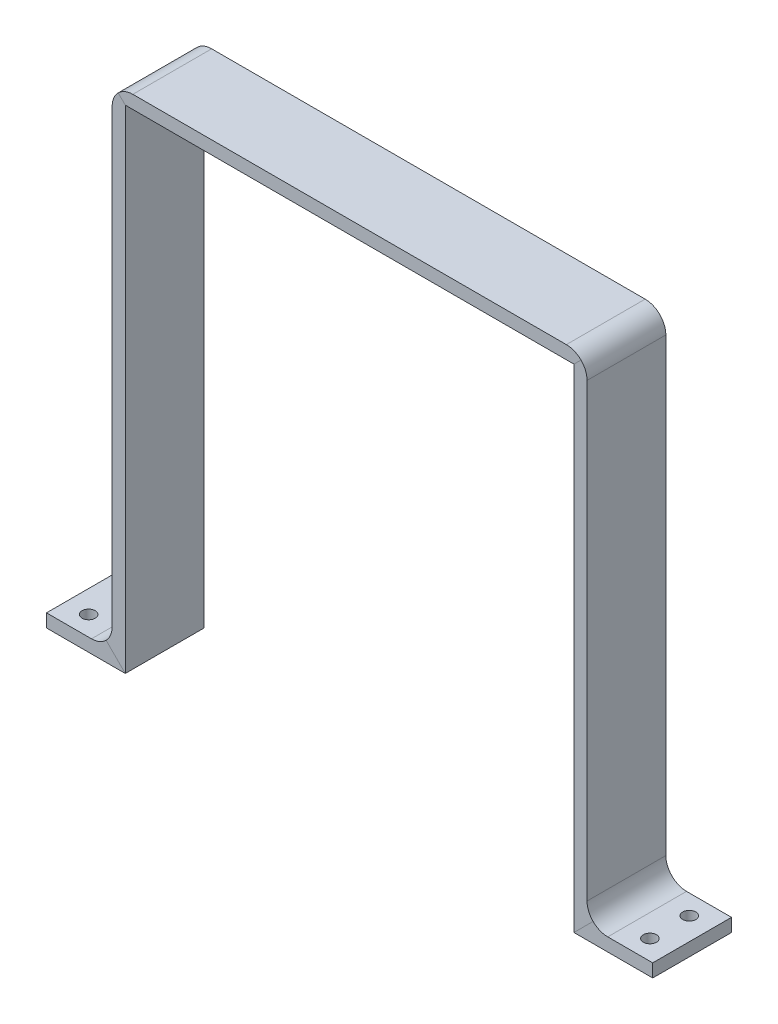
ISO-10303-21;
HEADER;
FILE_DESCRIPTION(('STEP AP214'),'2;1');
FILE_NAME('part.step','',(''),(''),'','','');
FILE_SCHEMA(('AUTOMOTIVE_DESIGN { 1 0 10303 214 1 1 1 1 }'));
ENDSEC;
DATA;
#1=APPLICATION_CONTEXT('core data for automotive mechanical design processes');
#2=APPLICATION_PROTOCOL_DEFINITION('international standard','automotive_design',2000,#1);
#3=PRODUCT_CONTEXT('',#1,'mechanical');
#4=PRODUCT('Part','Part','',(#3));
#5=PRODUCT_RELATED_PRODUCT_CATEGORY('part','',(#4));
#6=PRODUCT_DEFINITION_FORMATION('','',#4);
#7=PRODUCT_DEFINITION_CONTEXT('part definition',#1,'design');
#8=PRODUCT_DEFINITION('design','',#6,#7);
#9=PRODUCT_DEFINITION_SHAPE('','',#8);
#10=(LENGTH_UNIT() NAMED_UNIT(*) SI_UNIT(.MILLI.,.METRE.));
#11=(NAMED_UNIT(*) PLANE_ANGLE_UNIT() SI_UNIT($,.RADIAN.));
#12=(NAMED_UNIT(*) SI_UNIT($,.STERADIAN.) SOLID_ANGLE_UNIT());
#13=UNCERTAINTY_MEASURE_WITH_UNIT(LENGTH_MEASURE(1.E-05),#10,'distance_accuracy_value','');
#14=(GEOMETRIC_REPRESENTATION_CONTEXT(3) GLOBAL_UNCERTAINTY_ASSIGNED_CONTEXT((#13)) GLOBAL_UNIT_ASSIGNED_CONTEXT((#10,
#11,#12)) REPRESENTATION_CONTEXT('',''));
#15=CARTESIAN_POINT('',(0.,0.,0.));
#16=DIRECTION('',(0.,0.,1.));
#17=DIRECTION('',(1.,0.,0.));
#18=AXIS2_PLACEMENT_3D('',#15,#16,#17);
#19=CARTESIAN_POINT('',(0.,0.,0.));
#20=DIRECTION('',(-1.,0.,0.));
#21=DIRECTION('',(0.,0.,1.));
#22=AXIS2_PLACEMENT_3D('',#19,#20,#21);
#23=PLANE('',#22);
#24=DIRECTION('',(0.,-1.,0.));
#25=VECTOR('',#24,1.);
#26=CARTESIAN_POINT('',(0.,0.,0.));
#27=LINE('',#26,#25);
#28=CARTESIAN_POINT('',(0.,6.35,0.));
#29=VERTEX_POINT('',#28);
#30=CARTESIAN_POINT('',(0.,0.,0.));
#31=VERTEX_POINT('',#30);
#32=EDGE_CURVE('E282',#29,#31,#27,.T.);
#33=ORIENTED_EDGE('',*,*,#32,.F.);
#34=DIRECTION('',(0.,0.,1.));
#35=VECTOR('',#34,1.);
#36=CARTESIAN_POINT('',(0.,6.35,0.));
#37=LINE('',#36,#35);
#38=CARTESIAN_POINT('',(0.,6.35,-38.1));
#39=VERTEX_POINT('',#38);
#40=EDGE_CURVE('E291',#39,#29,#37,.T.);
#41=ORIENTED_EDGE('',*,*,#40,.F.);
#42=DIRECTION('',(0.,1.,0.));
#43=VECTOR('',#42,1.);
#44=CARTESIAN_POINT('',(0.,0.,-38.1));
#45=LINE('',#44,#43);
#46=CARTESIAN_POINT('',(0.,0.,-38.1));
#47=VERTEX_POINT('',#46);
#48=EDGE_CURVE('E295',#47,#39,#45,.T.);
#49=ORIENTED_EDGE('',*,*,#48,.F.);
#50=DIRECTION('',(0.,0.,-1.));
#51=VECTOR('',#50,1.);
#52=CARTESIAN_POINT('',(0.,0.,0.));
#53=LINE('',#52,#51);
#54=EDGE_CURVE('E278',#31,#47,#53,.T.);
#55=ORIENTED_EDGE('',*,*,#54,.F.);
#56=EDGE_LOOP('',(#33,#41,#49,#55));
#57=FACE_BOUND('',#56,.T.);
#58=ADVANCED_FACE('F39',(#57),#23,.T.);
#59=CARTESIAN_POINT('',(31.015,237.998,-38.1));
#60=DIRECTION('',(0.,0.,-1.));
#61=DIRECTION('',(-1.,0.,0.));
#62=AXIS2_PLACEMENT_3D('',#59,#60,#61);
#63=PLANE('',#62);
#64=DIRECTION('',(1.,0.,0.));
#65=VECTOR('',#64,1.);
#66=CARTESIAN_POINT('',(31.015,244.348,-38.1));
#67=LINE('',#66,#65);
#68=CARTESIAN_POINT('',(41.75,244.348,-38.1));
#69=VERTEX_POINT('',#68);
#70=CARTESIAN_POINT('',(251.366,244.348,-38.1));
#71=VERTEX_POINT('',#70);
#72=EDGE_CURVE('E351',#69,#71,#67,.T.);
#73=ORIENTED_EDGE('',*,*,#72,.T.);
#74=CARTESIAN_POINT('',(251.366,234.348,-38.1));
#75=DIRECTION('',(0.,0.,-1.));
#76=DIRECTION('',(-1.,0.,0.));
#77=AXIS2_PLACEMENT_3D('',#74,#75,#76);
#78=CIRCLE('',#77,10.);
#79=CARTESIAN_POINT('',(258.437067811865,241.419067811865,-38.1));
#80=VERTEX_POINT('',#79);
#81=EDGE_CURVE('E416',#71,#80,#78,.T.);
#82=ORIENTED_EDGE('',*,*,#81,.T.);
#83=DIRECTION('',(0.707106781186547,0.707106781186547,0.));
#84=VECTOR('',#83,1.);
#85=CARTESIAN_POINT('',(136.017,118.999,-38.1));
#86=LINE('',#85,#84);
#87=CARTESIAN_POINT('',(255.016,237.998,-38.1));
#88=VERTEX_POINT('',#87);
#89=EDGE_CURVE('E184',#88,#80,#86,.T.);
#90=ORIENTED_EDGE('',*,*,#89,.F.);
#91=DIRECTION('',(1.,0.,0.));
#92=VECTOR('',#91,1.);
#93=CARTESIAN_POINT('',(31.015,237.998,-38.1));
#94=LINE('',#93,#92);
#95=CARTESIAN_POINT('',(38.1,237.998,-38.1));
#96=VERTEX_POINT('',#95);
#97=EDGE_CURVE('E330',#96,#88,#94,.T.);
#98=ORIENTED_EDGE('',*,*,#97,.F.);
#99=DIRECTION('',(0.707106781186548,-0.707106781186548,0.));
#100=VECTOR('',#99,1.);
#101=CARTESIAN_POINT('',(157.099,118.999,-38.1));
#102=LINE('',#101,#100);
#103=CARTESIAN_POINT('',(34.6789321881345,241.419067811865,-38.1));
#104=VERTEX_POINT('',#103);
#105=EDGE_CURVE('E324',#104,#96,#102,.T.);
#106=ORIENTED_EDGE('',*,*,#105,.F.);
#107=CARTESIAN_POINT('',(41.75,234.348,-38.1));
#108=DIRECTION('',(0.,0.,-1.));
#109=DIRECTION('',(-1.,0.,0.));
#110=AXIS2_PLACEMENT_3D('',#107,#108,#109);
#111=CIRCLE('',#110,10.);
#112=EDGE_CURVE('E370',#104,#69,#111,.T.);
#113=ORIENTED_EDGE('',*,*,#112,.T.);
#114=EDGE_LOOP('',(#73,#82,#90,#98,#106,#113));
#115=FACE_BOUND('',#114,.T.);
#116=ADVANCED_FACE('F460',(#115),#63,.T.);
#117=CARTESIAN_POINT('',(31.015,244.348,0.));
#118=DIRECTION('',(0.,1.,0.));
#119=DIRECTION('',(0.,0.,1.));
#120=AXIS2_PLACEMENT_3D('',#117,#118,#119);
#121=PLANE('',#120);
#122=DIRECTION('',(1.,0.,0.));
#123=VECTOR('',#122,1.);
#124=CARTESIAN_POINT('',(31.015,244.348,0.));
#125=LINE('',#124,#123);
#126=CARTESIAN_POINT('',(41.75,244.348,0.));
#127=VERTEX_POINT('',#126);
#128=CARTESIAN_POINT('',(251.366,244.348,0.));
#129=VERTEX_POINT('',#128);
#130=EDGE_CURVE('E347',#127,#129,#125,.T.);
#131=ORIENTED_EDGE('',*,*,#130,.T.);
#132=DIRECTION('',(0.,0.,1.));
#133=VECTOR('',#132,1.);
#134=CARTESIAN_POINT('',(251.366,244.348,0.));
#135=LINE('',#134,#133);
#136=EDGE_CURVE('E413',#129,#71,#135,.F.);
#137=ORIENTED_EDGE('',*,*,#136,.T.);
#138=ORIENTED_EDGE('',*,*,#72,.F.);
#139=DIRECTION('',(0.,0.,-1.));
#140=VECTOR('',#139,1.);
#141=CARTESIAN_POINT('',(41.75,244.348,0.));
#142=LINE('',#141,#140);
#143=EDGE_CURVE('E373',#69,#127,#142,.F.);
#144=ORIENTED_EDGE('',*,*,#143,.T.);
#145=EDGE_LOOP('',(#131,#137,#138,#144));
#146=FACE_BOUND('',#145,.T.);
#147=ADVANCED_FACE('F514',(#146),#121,.T.);
#148=CARTESIAN_POINT('',(31.015,237.998,0.));
#149=DIRECTION('',(0.,0.,1.));
#150=DIRECTION('',(1.,0.,0.));
#151=AXIS2_PLACEMENT_3D('',#148,#149,#150);
#152=PLANE('',#151);
#153=DIRECTION('',(-0.707106781186547,-0.707106781186547,0.));
#154=VECTOR('',#153,1.);
#155=CARTESIAN_POINT('',(136.017,118.999,0.));
#156=LINE('',#155,#154);
#157=CARTESIAN_POINT('',(258.437067811865,241.419067811865,0.));
#158=VERTEX_POINT('',#157);
#159=CARTESIAN_POINT('',(255.016,237.998,0.));
#160=VERTEX_POINT('',#159);
#161=EDGE_CURVE('E243',#158,#160,#156,.T.);
#162=ORIENTED_EDGE('',*,*,#161,.F.);
#163=CARTESIAN_POINT('',(251.366,234.348,0.));
#164=DIRECTION('',(0.,0.,1.));
#165=DIRECTION('',(1.,0.,0.));
#166=AXIS2_PLACEMENT_3D('',#163,#164,#165);
#167=CIRCLE('',#166,10.);
#168=EDGE_CURVE('E410',#158,#129,#167,.T.);
#169=ORIENTED_EDGE('',*,*,#168,.T.);
#170=ORIENTED_EDGE('',*,*,#130,.F.);
#171=CARTESIAN_POINT('',(41.75,234.348,0.));
#172=DIRECTION('',(0.,0.,1.));
#173=DIRECTION('',(1.,0.,0.));
#174=AXIS2_PLACEMENT_3D('',#171,#172,#173);
#175=CIRCLE('',#174,10.);
#176=CARTESIAN_POINT('',(34.6789321881345,241.419067811865,0.));
#177=VERTEX_POINT('',#176);
#178=EDGE_CURVE('E376',#127,#177,#175,.T.);
#179=ORIENTED_EDGE('',*,*,#178,.T.);
#180=DIRECTION('',(-0.707106781186548,0.707106781186548,0.));
#181=VECTOR('',#180,1.);
#182=CARTESIAN_POINT('',(157.099,118.999,0.));
#183=LINE('',#182,#181);
#184=CARTESIAN_POINT('',(38.1,237.998,0.));
#185=VERTEX_POINT('',#184);
#186=EDGE_CURVE('E307',#185,#177,#183,.T.);
#187=ORIENTED_EDGE('',*,*,#186,.F.);
#188=DIRECTION('',(1.,0.,0.));
#189=VECTOR('',#188,1.);
#190=CARTESIAN_POINT('',(31.015,237.998,0.));
#191=LINE('',#190,#189);
#192=EDGE_CURVE('E261',#185,#160,#191,.T.);
#193=ORIENTED_EDGE('',*,*,#192,.T.);
#194=EDGE_LOOP('',(#162,#169,#170,#179,#187,#193));
#195=FACE_BOUND('',#194,.T.);
#196=ADVANCED_FACE('F450',(#195),#152,.T.);
#197=CARTESIAN_POINT('',(31.015,237.998,0.));
#198=DIRECTION('',(0.,-1.,0.));
#199=DIRECTION('',(0.,0.,-1.));
#200=AXIS2_PLACEMENT_3D('',#197,#198,#199);
#201=PLANE('',#200);
#202=DIRECTION('',(0.,0.,1.));
#203=VECTOR('',#202,1.);
#204=CARTESIAN_POINT('',(38.1,237.998,0.));
#205=LINE('',#204,#203);
#206=EDGE_CURVE('E320',#96,#185,#205,.T.);
#207=ORIENTED_EDGE('',*,*,#206,.F.);
#208=ORIENTED_EDGE('',*,*,#97,.T.);
#209=DIRECTION('',(0.,0.,-1.));
#210=VECTOR('',#209,1.);
#211=CARTESIAN_POINT('',(255.016,237.998,0.));
#212=LINE('',#211,#210);
#213=EDGE_CURVE('E193',#160,#88,#212,.T.);
#214=ORIENTED_EDGE('',*,*,#213,.F.);
#215=ORIENTED_EDGE('',*,*,#192,.F.);
#216=EDGE_LOOP('',(#207,#208,#214,#215));
#217=FACE_BOUND('',#216,.T.);
#218=ADVANCED_FACE('F455',(#217),#201,.T.);
#219=CARTESIAN_POINT('',(38.1,0.,0.));
#220=DIRECTION('',(1.,0.,0.));
#221=DIRECTION('',(0.,1.,0.));
#222=AXIS2_PLACEMENT_3D('',#219,#220,#221);
#223=PLANE('',#222);
#224=DIRECTION('',(0.,1.,0.));
#225=VECTOR('',#224,1.);
#226=CARTESIAN_POINT('',(38.1,0.,-38.1));
#227=LINE('',#226,#225);
#228=CARTESIAN_POINT('',(38.1,0.,-38.1));
#229=VERTEX_POINT('',#228);
#230=EDGE_CURVE('E331',#229,#96,#227,.T.);
#231=ORIENTED_EDGE('',*,*,#230,.T.);
#232=ORIENTED_EDGE('',*,*,#206,.T.);
#233=DIRECTION('',(0.,1.,0.));
#234=VECTOR('',#233,1.);
#235=CARTESIAN_POINT('',(38.1,0.,0.));
#236=LINE('',#235,#234);
#237=CARTESIAN_POINT('',(38.1,0.,0.));
#238=VERTEX_POINT('',#237);
#239=EDGE_CURVE('E325',#238,#185,#236,.T.);
#240=ORIENTED_EDGE('',*,*,#239,.F.);
#241=DIRECTION('',(0.,0.,-1.));
#242=VECTOR('',#241,1.);
#243=CARTESIAN_POINT('',(38.1,0.,0.));
#244=LINE('',#243,#242);
#245=EDGE_CURVE('E273',#238,#229,#244,.T.);
#246=ORIENTED_EDGE('',*,*,#245,.T.);
#247=EDGE_LOOP('',(#231,#232,#240,#246));
#248=FACE_BOUND('',#247,.T.);
#249=ADVANCED_FACE('F495',(#248),#223,.T.);
#250=CARTESIAN_POINT('',(38.1,0.,0.));
#251=DIRECTION('',(0.,0.,1.));
#252=DIRECTION('',(1.,0.,0.));
#253=AXIS2_PLACEMENT_3D('',#250,#251,#252);
#254=PLANE('',#253);
#255=ORIENTED_EDGE('',*,*,#186,.T.);
#256=CARTESIAN_POINT('',(41.75,234.348,0.));
#257=DIRECTION('',(0.,0.,1.));
#258=DIRECTION('',(1.,0.,0.));
#259=AXIS2_PLACEMENT_3D('',#256,#257,#258);
#260=CIRCLE('',#259,10.);
#261=CARTESIAN_POINT('',(31.75,234.348,0.));
#262=VERTEX_POINT('',#261);
#263=EDGE_CURVE('E379',#177,#262,#260,.T.);
#264=ORIENTED_EDGE('',*,*,#263,.T.);
#265=DIRECTION('',(0.,1.,0.));
#266=VECTOR('',#265,1.);
#267=CARTESIAN_POINT('',(31.75,0.,0.));
#268=LINE('',#267,#266);
#269=CARTESIAN_POINT('',(31.75,16.35,0.));
#270=VERTEX_POINT('',#269);
#271=EDGE_CURVE('E329',#270,#262,#268,.T.);
#272=ORIENTED_EDGE('',*,*,#271,.F.);
#273=CARTESIAN_POINT('',(21.75,16.35,0.));
#274=DIRECTION('',(0.,0.,1.));
#275=DIRECTION('',(1.,0.,0.));
#276=AXIS2_PLACEMENT_3D('',#273,#274,#275);
#277=CIRCLE('',#276,10.);
#278=CARTESIAN_POINT('',(28.8210678118655,9.27893218813453,0.));
#279=VERTEX_POINT('',#278);
#280=EDGE_CURVE('E389',#270,#279,#277,.F.);
#281=ORIENTED_EDGE('',*,*,#280,.T.);
#282=DIRECTION('',(-0.707106781186548,0.707106781186548,0.));
#283=VECTOR('',#282,1.);
#284=CARTESIAN_POINT('',(19.05,19.05,0.));
#285=LINE('',#284,#283);
#286=EDGE_CURVE('E304',#238,#279,#285,.T.);
#287=ORIENTED_EDGE('',*,*,#286,.F.);
#288=ORIENTED_EDGE('',*,*,#239,.T.);
#289=EDGE_LOOP('',(#255,#264,#272,#281,#287,#288));
#290=FACE_BOUND('',#289,.T.);
#291=ADVANCED_FACE('F498',(#290),#254,.T.);
#292=CARTESIAN_POINT('',(31.75,0.,0.));
#293=DIRECTION('',(-1.,0.,0.));
#294=DIRECTION('',(0.,-1.,0.));
#295=AXIS2_PLACEMENT_3D('',#292,#293,#294);
#296=PLANE('',#295);
#297=DIRECTION('',(0.,1.,0.));
#298=VECTOR('',#297,1.);
#299=CARTESIAN_POINT('',(31.75,0.,-38.1));
#300=LINE('',#299,#298);
#301=CARTESIAN_POINT('',(31.75,16.35,-38.1));
#302=VERTEX_POINT('',#301);
#303=CARTESIAN_POINT('',(31.75,234.348,-38.1));
#304=VERTEX_POINT('',#303);
#305=EDGE_CURVE('E335',#302,#304,#300,.T.);
#306=ORIENTED_EDGE('',*,*,#305,.F.);
#307=DIRECTION('',(0.,0.,-1.));
#308=VECTOR('',#307,1.);
#309=CARTESIAN_POINT('',(31.75,16.35,0.));
#310=LINE('',#309,#308);
#311=EDGE_CURVE('E364',#302,#270,#310,.F.);
#312=ORIENTED_EDGE('',*,*,#311,.T.);
#313=ORIENTED_EDGE('',*,*,#271,.T.);
#314=DIRECTION('',(0.,0.,-1.));
#315=VECTOR('',#314,1.);
#316=CARTESIAN_POINT('',(31.75,234.348,0.));
#317=LINE('',#316,#315);
#318=EDGE_CURVE('E360',#262,#304,#317,.T.);
#319=ORIENTED_EDGE('',*,*,#318,.T.);
#320=EDGE_LOOP('',(#306,#312,#313,#319));
#321=FACE_BOUND('',#320,.T.);
#322=ADVANCED_FACE('F504',(#321),#296,.T.);
#323=CARTESIAN_POINT('',(38.1,0.,-38.1));
#324=DIRECTION('',(0.,0.,-1.));
#325=DIRECTION('',(-1.,0.,0.));
#326=AXIS2_PLACEMENT_3D('',#323,#324,#325);
#327=PLANE('',#326);
#328=ORIENTED_EDGE('',*,*,#305,.T.);
#329=CARTESIAN_POINT('',(41.75,234.348,-38.1));
#330=DIRECTION('',(0.,0.,-1.));
#331=DIRECTION('',(-1.,0.,0.));
#332=AXIS2_PLACEMENT_3D('',#329,#330,#331);
#333=CIRCLE('',#332,10.);
#334=EDGE_CURVE('E367',#304,#104,#333,.T.);
#335=ORIENTED_EDGE('',*,*,#334,.T.);
#336=ORIENTED_EDGE('',*,*,#105,.T.);
#337=ORIENTED_EDGE('',*,*,#230,.F.);
#338=DIRECTION('',(0.707106781186548,-0.707106781186548,0.));
#339=VECTOR('',#338,1.);
#340=CARTESIAN_POINT('',(19.05,19.05,-38.1));
#341=LINE('',#340,#339);
#342=CARTESIAN_POINT('',(28.8210678118655,9.27893218813453,-38.1));
#343=VERTEX_POINT('',#342);
#344=EDGE_CURVE('E277',#343,#229,#341,.T.);
#345=ORIENTED_EDGE('',*,*,#344,.F.);
#346=CARTESIAN_POINT('',(21.75,16.35,-38.1));
#347=DIRECTION('',(0.,0.,-1.));
#348=DIRECTION('',(-1.,0.,0.));
#349=AXIS2_PLACEMENT_3D('',#346,#347,#348);
#350=CIRCLE('',#349,10.);
#351=EDGE_CURVE('E386',#343,#302,#350,.F.);
#352=ORIENTED_EDGE('',*,*,#351,.T.);
#353=EDGE_LOOP('',(#328,#335,#336,#337,#345,#352));
#354=FACE_BOUND('',#353,.T.);
#355=ADVANCED_FACE('F500',(#354),#327,.T.);
#356=CARTESIAN_POINT('',(0.,0.,0.));
#357=DIRECTION('',(0.,-1.,0.));
#358=DIRECTION('',(0.,0.,-1.));
#359=AXIS2_PLACEMENT_3D('',#356,#357,#358);
#360=PLANE('',#359);
#361=CARTESIAN_POINT('',(10.875,0.,-28.575));
#362=DIRECTION('',(0.,-1.,0.));
#363=DIRECTION('',(0.,0.,-1.));
#364=AXIS2_PLACEMENT_3D('',#361,#362,#363);
#365=CIRCLE('',#364,3.175);
#366=CARTESIAN_POINT('',(10.875,0.,-31.75));
#367=VERTEX_POINT('',#366);
#368=EDGE_CURVE('E262',#367,#367,#365,.F.);
#369=ORIENTED_EDGE('',*,*,#368,.T.);
#370=EDGE_LOOP('',(#369));
#371=FACE_BOUND('',#370,.T.);
#372=CARTESIAN_POINT('',(10.875,0.,-9.525));
#373=DIRECTION('',(0.,-1.,0.));
#374=DIRECTION('',(0.,0.,-1.));
#375=AXIS2_PLACEMENT_3D('',#372,#373,#374);
#376=CIRCLE('',#375,3.175);
#377=CARTESIAN_POINT('',(10.875,0.,-12.7));
#378=VERTEX_POINT('',#377);
#379=EDGE_CURVE('E233',#378,#378,#376,.F.);
#380=ORIENTED_EDGE('',*,*,#379,.T.);
#381=EDGE_LOOP('',(#380));
#382=FACE_BOUND('',#381,.T.);
#383=ORIENTED_EDGE('',*,*,#245,.F.);
#384=DIRECTION('',(1.,0.,0.));
#385=VECTOR('',#384,1.);
#386=CARTESIAN_POINT('',(0.,0.,0.));
#387=LINE('',#386,#385);
#388=EDGE_CURVE('E276',#31,#238,#387,.T.);
#389=ORIENTED_EDGE('',*,*,#388,.F.);
#390=ORIENTED_EDGE('',*,*,#54,.T.);
#391=DIRECTION('',(1.,0.,0.));
#392=VECTOR('',#391,1.);
#393=CARTESIAN_POINT('',(0.,0.,-38.1));
#394=LINE('',#393,#392);
#395=EDGE_CURVE('E283',#47,#229,#394,.T.);
#396=ORIENTED_EDGE('',*,*,#395,.T.);
#397=EDGE_LOOP('',(#383,#389,#390,#396));
#398=FACE_BOUND('',#397,.T.);
#399=ADVANCED_FACE('F503',(#371,#382,#398),#360,.T.);
#400=CARTESIAN_POINT('',(0.,0.,-38.1));
#401=DIRECTION('',(0.,0.,-1.));
#402=DIRECTION('',(-1.,0.,0.));
#403=AXIS2_PLACEMENT_3D('',#400,#401,#402);
#404=PLANE('',#403);
#405=DIRECTION('',(1.,0.,0.));
#406=VECTOR('',#405,1.);
#407=CARTESIAN_POINT('',(0.,6.35,-38.1));
#408=LINE('',#407,#406);
#409=CARTESIAN_POINT('',(21.75,6.35,-38.1));
#410=VERTEX_POINT('',#409);
#411=EDGE_CURVE('E299',#39,#410,#408,.T.);
#412=ORIENTED_EDGE('',*,*,#411,.T.);
#413=CARTESIAN_POINT('',(21.75,16.35,-38.1));
#414=DIRECTION('',(0.,0.,-1.));
#415=DIRECTION('',(-1.,0.,0.));
#416=AXIS2_PLACEMENT_3D('',#413,#414,#415);
#417=CIRCLE('',#416,10.);
#418=EDGE_CURVE('E382',#410,#343,#417,.F.);
#419=ORIENTED_EDGE('',*,*,#418,.T.);
#420=ORIENTED_EDGE('',*,*,#344,.T.);
#421=ORIENTED_EDGE('',*,*,#395,.F.);
#422=ORIENTED_EDGE('',*,*,#48,.T.);
#423=EDGE_LOOP('',(#412,#419,#420,#421,#422));
#424=FACE_BOUND('',#423,.T.);
#425=ADVANCED_FACE('F490',(#424),#404,.T.);
#426=CARTESIAN_POINT('',(0.,6.35,0.));
#427=DIRECTION('',(0.,1.,0.));
#428=DIRECTION('',(0.,0.,1.));
#429=AXIS2_PLACEMENT_3D('',#426,#427,#428);
#430=PLANE('',#429);
#431=CARTESIAN_POINT('',(10.875,6.35,-28.575));
#432=DIRECTION('',(0.,1.,0.));
#433=DIRECTION('',(0.,0.,1.));
#434=AXIS2_PLACEMENT_3D('',#431,#432,#433);
#435=CIRCLE('',#434,3.175);
#436=CARTESIAN_POINT('',(10.875,6.35,-25.4));
#437=VERTEX_POINT('',#436);
#438=EDGE_CURVE('E257',#437,#437,#435,.T.);
#439=ORIENTED_EDGE('',*,*,#438,.F.);
#440=EDGE_LOOP('',(#439));
#441=FACE_BOUND('',#440,.T.);
#442=CARTESIAN_POINT('',(10.875,6.35,-9.525));
#443=DIRECTION('',(0.,1.,0.));
#444=DIRECTION('',(0.,0.,1.));
#445=AXIS2_PLACEMENT_3D('',#442,#443,#444);
#446=CIRCLE('',#445,3.175);
#447=CARTESIAN_POINT('',(10.875,6.35,-6.35));
#448=VERTEX_POINT('',#447);
#449=EDGE_CURVE('E266',#448,#448,#446,.T.);
#450=ORIENTED_EDGE('',*,*,#449,.F.);
#451=EDGE_LOOP('',(#450));
#452=FACE_BOUND('',#451,.T.);
#453=DIRECTION('',(1.,0.,0.));
#454=VECTOR('',#453,1.);
#455=CARTESIAN_POINT('',(0.,6.35,0.));
#456=LINE('',#455,#454);
#457=CARTESIAN_POINT('',(21.75,6.35,0.));
#458=VERTEX_POINT('',#457);
#459=EDGE_CURVE('E287',#29,#458,#456,.T.);
#460=ORIENTED_EDGE('',*,*,#459,.T.);
#461=DIRECTION('',(0.,0.,-1.));
#462=VECTOR('',#461,1.);
#463=CARTESIAN_POINT('',(21.75,6.35,-38.1));
#464=LINE('',#463,#462);
#465=EDGE_CURVE('E303',#458,#410,#464,.T.);
#466=ORIENTED_EDGE('',*,*,#465,.T.);
#467=ORIENTED_EDGE('',*,*,#411,.F.);
#468=ORIENTED_EDGE('',*,*,#40,.T.);
#469=EDGE_LOOP('',(#460,#466,#467,#468));
#470=FACE_BOUND('',#469,.T.);
#471=ADVANCED_FACE('F480',(#441,#452,#470),#430,.T.);
#472=CARTESIAN_POINT('',(0.,0.,0.));
#473=DIRECTION('',(0.,0.,1.));
#474=DIRECTION('',(1.,0.,0.));
#475=AXIS2_PLACEMENT_3D('',#472,#473,#474);
#476=PLANE('',#475);
#477=ORIENTED_EDGE('',*,*,#388,.T.);
#478=ORIENTED_EDGE('',*,*,#286,.T.);
#479=CARTESIAN_POINT('',(21.75,16.35,0.));
#480=DIRECTION('',(0.,0.,1.));
#481=DIRECTION('',(1.,0.,0.));
#482=AXIS2_PLACEMENT_3D('',#479,#480,#481);
#483=CIRCLE('',#482,10.);
#484=EDGE_CURVE('E393',#279,#458,#483,.F.);
#485=ORIENTED_EDGE('',*,*,#484,.T.);
#486=ORIENTED_EDGE('',*,*,#459,.F.);
#487=ORIENTED_EDGE('',*,*,#32,.T.);
#488=EDGE_LOOP('',(#477,#478,#485,#486,#487));
#489=FACE_BOUND('',#488,.T.);
#490=ADVANCED_FACE('F477',(#489),#476,.T.);
#491=CARTESIAN_POINT('',(21.75,16.35,0.));
#492=DIRECTION('',(0.,0.,1.));
#493=DIRECTION('',(1.,0.,0.));
#494=AXIS2_PLACEMENT_3D('',#491,#492,#493);
#495=CYLINDRICAL_SURFACE('',#494,10.);
#496=ORIENTED_EDGE('',*,*,#280,.F.);
#497=ORIENTED_EDGE('',*,*,#311,.F.);
#498=ORIENTED_EDGE('',*,*,#351,.F.);
#499=ORIENTED_EDGE('',*,*,#418,.F.);
#500=ORIENTED_EDGE('',*,*,#465,.F.);
#501=ORIENTED_EDGE('',*,*,#484,.F.);
#502=EDGE_LOOP('',(#496,#497,#498,#499,#500,#501));
#503=FACE_BOUND('',#502,.T.);
#504=ADVANCED_FACE('F479',(#503),#495,.F.);
#505=CARTESIAN_POINT('',(41.75,234.348,0.));
#506=DIRECTION('',(0.,0.,-1.));
#507=DIRECTION('',(-1.,0.,0.));
#508=AXIS2_PLACEMENT_3D('',#505,#506,#507);
#509=CYLINDRICAL_SURFACE('',#508,10.);
#510=ORIENTED_EDGE('',*,*,#178,.F.);
#511=ORIENTED_EDGE('',*,*,#143,.F.);
#512=ORIENTED_EDGE('',*,*,#112,.F.);
#513=ORIENTED_EDGE('',*,*,#334,.F.);
#514=ORIENTED_EDGE('',*,*,#318,.F.);
#515=ORIENTED_EDGE('',*,*,#263,.F.);
#516=EDGE_LOOP('',(#510,#511,#512,#513,#514,#515));
#517=FACE_BOUND('',#516,.T.);
#518=ADVANCED_FACE('F487',(#517),#509,.T.);
#519=CARTESIAN_POINT('',(10.875,-0.00100000000001401,-9.525));
#520=DIRECTION('',(0.,1.,0.));
#521=DIRECTION('',(0.,0.,1.));
#522=AXIS2_PLACEMENT_3D('',#519,#520,#521);
#523=CYLINDRICAL_SURFACE('',#522,3.175);
#524=ORIENTED_EDGE('',*,*,#379,.F.);
#525=EDGE_LOOP('',(#524));
#526=FACE_BOUND('',#525,.T.);
#527=ORIENTED_EDGE('',*,*,#449,.T.);
#528=EDGE_LOOP('',(#527));
#529=FACE_BOUND('',#528,.T.);
#530=ADVANCED_FACE('F472',(#526,#529),#523,.F.);
#531=CARTESIAN_POINT('',(10.875,-0.00100000000001401,-28.575));
#532=DIRECTION('',(0.,1.,0.));
#533=DIRECTION('',(0.,0.,1.));
#534=AXIS2_PLACEMENT_3D('',#531,#532,#533);
#535=CYLINDRICAL_SURFACE('',#534,3.175);
#536=ORIENTED_EDGE('',*,*,#368,.F.);
#537=EDGE_LOOP('',(#536));
#538=FACE_BOUND('',#537,.T.);
#539=ORIENTED_EDGE('',*,*,#438,.T.);
#540=EDGE_LOOP('',(#539));
#541=FACE_BOUND('',#540,.T.);
#542=ADVANCED_FACE('F465',(#538,#541),#535,.F.);
#543=CARTESIAN_POINT('',(293.116,0.,0.));
#544=DIRECTION('',(1.,0.,0.));
#545=DIRECTION('',(0.,0.,1.));
#546=AXIS2_PLACEMENT_3D('',#543,#544,#545);
#547=PLANE('',#546);
#548=DIRECTION('',(0.,-1.,0.));
#549=VECTOR('',#548,1.);
#550=CARTESIAN_POINT('',(293.116,0.,0.));
#551=LINE('',#550,#549);
#552=CARTESIAN_POINT('',(293.116,0.,0.));
#553=VERTEX_POINT('',#552);
#554=CARTESIAN_POINT('',(293.116,6.35,0.));
#555=VERTEX_POINT('',#554);
#556=EDGE_CURVE('E228',#553,#555,#551,.F.);
#557=ORIENTED_EDGE('',*,*,#556,.F.);
#558=DIRECTION('',(0.,0.,-1.));
#559=VECTOR('',#558,1.);
#560=CARTESIAN_POINT('',(293.116,0.,0.));
#561=LINE('',#560,#559);
#562=CARTESIAN_POINT('',(293.116,0.,-38.1));
#563=VERTEX_POINT('',#562);
#564=EDGE_CURVE('E221',#563,#553,#561,.F.);
#565=ORIENTED_EDGE('',*,*,#564,.F.);
#566=DIRECTION('',(0.,1.,0.));
#567=VECTOR('',#566,1.);
#568=CARTESIAN_POINT('',(293.116,0.,-38.1));
#569=LINE('',#568,#567);
#570=CARTESIAN_POINT('',(293.116,6.35,-38.1));
#571=VERTEX_POINT('',#570);
#572=EDGE_CURVE('E211',#571,#563,#569,.F.);
#573=ORIENTED_EDGE('',*,*,#572,.F.);
#574=DIRECTION('',(0.,0.,1.));
#575=VECTOR('',#574,1.);
#576=CARTESIAN_POINT('',(293.116,6.35,0.));
#577=LINE('',#576,#575);
#578=EDGE_CURVE('E224',#555,#571,#577,.F.);
#579=ORIENTED_EDGE('',*,*,#578,.F.);
#580=EDGE_LOOP('',(#557,#565,#573,#579));
#581=FACE_BOUND('',#580,.T.);
#582=ADVANCED_FACE('F463',(#581),#547,.T.);
#583=CARTESIAN_POINT('',(255.016,0.,0.));
#584=DIRECTION('',(-1.,0.,0.));
#585=DIRECTION('',(0.,-1.,0.));
#586=AXIS2_PLACEMENT_3D('',#583,#584,#585);
#587=PLANE('',#586);
#588=DIRECTION('',(0.,1.,0.));
#589=VECTOR('',#588,1.);
#590=CARTESIAN_POINT('',(255.016,0.,0.));
#591=LINE('',#590,#589);
#592=CARTESIAN_POINT('',(255.016,0.,0.));
#593=VERTEX_POINT('',#592);
#594=EDGE_CURVE('E245',#593,#160,#591,.T.);
#595=ORIENTED_EDGE('',*,*,#594,.T.);
#596=ORIENTED_EDGE('',*,*,#213,.T.);
#597=DIRECTION('',(0.,1.,0.));
#598=VECTOR('',#597,1.);
#599=CARTESIAN_POINT('',(255.016,0.,-38.1));
#600=LINE('',#599,#598);
#601=CARTESIAN_POINT('',(255.016,0.,-38.1));
#602=VERTEX_POINT('',#601);
#603=EDGE_CURVE('E179',#602,#88,#600,.T.);
#604=ORIENTED_EDGE('',*,*,#603,.F.);
#605=DIRECTION('',(0.,0.,-1.));
#606=VECTOR('',#605,1.);
#607=CARTESIAN_POINT('',(255.016,0.,0.));
#608=LINE('',#607,#606);
#609=EDGE_CURVE('E191',#602,#593,#608,.F.);
#610=ORIENTED_EDGE('',*,*,#609,.T.);
#611=EDGE_LOOP('',(#595,#596,#604,#610));
#612=FACE_BOUND('',#611,.T.);
#613=ADVANCED_FACE('F190',(#612),#587,.T.);
#614=CARTESIAN_POINT('',(255.016,0.,-38.1));
#615=DIRECTION('',(0.,0.,-1.));
#616=DIRECTION('',(-1.,0.,0.));
#617=AXIS2_PLACEMENT_3D('',#614,#615,#616);
#618=PLANE('',#617);
#619=ORIENTED_EDGE('',*,*,#89,.T.);
#620=CARTESIAN_POINT('',(251.366,234.348,-38.1));
#621=DIRECTION('',(0.,0.,-1.));
#622=DIRECTION('',(-1.,0.,0.));
#623=AXIS2_PLACEMENT_3D('',#620,#621,#622);
#624=CIRCLE('',#623,10.);
#625=CARTESIAN_POINT('',(261.366,234.348,-38.1));
#626=VERTEX_POINT('',#625);
#627=EDGE_CURVE('E419',#80,#626,#624,.T.);
#628=ORIENTED_EDGE('',*,*,#627,.T.);
#629=DIRECTION('',(0.,1.,0.));
#630=VECTOR('',#629,1.);
#631=CARTESIAN_POINT('',(261.366,0.,-38.1));
#632=LINE('',#631,#630);
#633=CARTESIAN_POINT('',(261.366,16.35,-38.1));
#634=VERTEX_POINT('',#633);
#635=EDGE_CURVE('E195',#634,#626,#632,.T.);
#636=ORIENTED_EDGE('',*,*,#635,.F.);
#637=CARTESIAN_POINT('',(271.366,16.35,-38.1));
#638=DIRECTION('',(0.,0.,-1.));
#639=DIRECTION('',(-1.,0.,0.));
#640=AXIS2_PLACEMENT_3D('',#637,#638,#639);
#641=CIRCLE('',#640,10.);
#642=CARTESIAN_POINT('',(264.294932188134,9.27893218813452,-38.1));
#643=VERTEX_POINT('',#642);
#644=EDGE_CURVE('E48',#634,#643,#641,.F.);
#645=ORIENTED_EDGE('',*,*,#644,.T.);
#646=DIRECTION('',(0.707106781186548,0.707106781186548,0.));
#647=VECTOR('',#646,1.);
#648=CARTESIAN_POINT('',(274.066,19.05,-38.1));
#649=LINE('',#648,#647);
#650=EDGE_CURVE('E54',#602,#643,#649,.T.);
#651=ORIENTED_EDGE('',*,*,#650,.F.);
#652=ORIENTED_EDGE('',*,*,#603,.T.);
#653=EDGE_LOOP('',(#619,#628,#636,#645,#651,#652));
#654=FACE_BOUND('',#653,.T.);
#655=ADVANCED_FACE('F178',(#654),#618,.T.);
#656=CARTESIAN_POINT('',(261.366,0.,0.));
#657=DIRECTION('',(1.,0.,0.));
#658=DIRECTION('',(0.,1.,0.));
#659=AXIS2_PLACEMENT_3D('',#656,#657,#658);
#660=PLANE('',#659);
#661=DIRECTION('',(0.,1.,0.));
#662=VECTOR('',#661,1.);
#663=CARTESIAN_POINT('',(261.366,0.,0.));
#664=LINE('',#663,#662);
#665=CARTESIAN_POINT('',(261.366,16.35,0.));
#666=VERTEX_POINT('',#665);
#667=CARTESIAN_POINT('',(261.366,234.348,0.));
#668=VERTEX_POINT('',#667);
#669=EDGE_CURVE('E248',#666,#668,#664,.T.);
#670=ORIENTED_EDGE('',*,*,#669,.F.);
#671=DIRECTION('',(0.,0.,1.));
#672=VECTOR('',#671,1.);
#673=CARTESIAN_POINT('',(261.366,16.35,-38.1));
#674=LINE('',#673,#672);
#675=EDGE_CURVE('E404',#666,#634,#674,.F.);
#676=ORIENTED_EDGE('',*,*,#675,.T.);
#677=ORIENTED_EDGE('',*,*,#635,.T.);
#678=DIRECTION('',(0.,0.,1.));
#679=VECTOR('',#678,1.);
#680=CARTESIAN_POINT('',(261.366,234.348,0.));
#681=LINE('',#680,#679);
#682=EDGE_CURVE('E400',#626,#668,#681,.T.);
#683=ORIENTED_EDGE('',*,*,#682,.T.);
#684=EDGE_LOOP('',(#670,#676,#677,#683));
#685=FACE_BOUND('',#684,.T.);
#686=ADVANCED_FACE('F441',(#685),#660,.T.);
#687=CARTESIAN_POINT('',(255.016,0.,0.));
#688=DIRECTION('',(0.,0.,1.));
#689=DIRECTION('',(1.,0.,0.));
#690=AXIS2_PLACEMENT_3D('',#687,#688,#689);
#691=PLANE('',#690);
#692=ORIENTED_EDGE('',*,*,#669,.T.);
#693=CARTESIAN_POINT('',(251.366,234.348,0.));
#694=DIRECTION('',(0.,0.,1.));
#695=DIRECTION('',(1.,0.,0.));
#696=AXIS2_PLACEMENT_3D('',#693,#694,#695);
#697=CIRCLE('',#696,10.);
#698=EDGE_CURVE('E407',#668,#158,#697,.T.);
#699=ORIENTED_EDGE('',*,*,#698,.T.);
#700=ORIENTED_EDGE('',*,*,#161,.T.);
#701=ORIENTED_EDGE('',*,*,#594,.F.);
#702=DIRECTION('',(-0.707106781186548,-0.707106781186548,0.));
#703=VECTOR('',#702,1.);
#704=CARTESIAN_POINT('',(274.066,19.05,0.));
#705=LINE('',#704,#703);
#706=CARTESIAN_POINT('',(264.294932188134,9.27893218813452,0.));
#707=VERTEX_POINT('',#706);
#708=EDGE_CURVE('E62',#707,#593,#705,.T.);
#709=ORIENTED_EDGE('',*,*,#708,.F.);
#710=CARTESIAN_POINT('',(271.366,16.35,0.));
#711=DIRECTION('',(0.,0.,1.));
#712=DIRECTION('',(1.,0.,0.));
#713=AXIS2_PLACEMENT_3D('',#710,#711,#712);
#714=CIRCLE('',#713,10.);
#715=EDGE_CURVE('E425',#707,#666,#714,.F.);
#716=ORIENTED_EDGE('',*,*,#715,.T.);
#717=EDGE_LOOP('',(#692,#699,#700,#701,#709,#716));
#718=FACE_BOUND('',#717,.T.);
#719=ADVANCED_FACE('F439',(#718),#691,.T.);
#720=CARTESIAN_POINT('',(293.116,0.,0.));
#721=DIRECTION('',(0.,-1.,0.));
#722=DIRECTION('',(0.,0.,-1.));
#723=AXIS2_PLACEMENT_3D('',#720,#721,#722);
#724=PLANE('',#723);
#725=CARTESIAN_POINT('',(282.241,0.,-28.575));
#726=DIRECTION('',(0.,-1.,0.));
#727=DIRECTION('',(0.,0.,-1.));
#728=AXIS2_PLACEMENT_3D('',#725,#726,#727);
#729=CIRCLE('',#728,3.175);
#730=CARTESIAN_POINT('',(282.241,0.,-31.75));
#731=VERTEX_POINT('',#730);
#732=EDGE_CURVE('E196',#731,#731,#729,.T.);
#733=ORIENTED_EDGE('',*,*,#732,.F.);
#734=EDGE_LOOP('',(#733));
#735=FACE_BOUND('',#734,.T.);
#736=CARTESIAN_POINT('',(282.241,0.,-9.525));
#737=DIRECTION('',(0.,-1.,0.));
#738=DIRECTION('',(0.,0.,-1.));
#739=AXIS2_PLACEMENT_3D('',#736,#737,#738);
#740=CIRCLE('',#739,3.175);
#741=CARTESIAN_POINT('',(282.241,0.,-12.7));
#742=VERTEX_POINT('',#741);
#743=EDGE_CURVE('E784',#742,#742,#740,.T.);
#744=ORIENTED_EDGE('',*,*,#743,.F.);
#745=EDGE_LOOP('',(#744));
#746=FACE_BOUND('',#745,.T.);
#747=ORIENTED_EDGE('',*,*,#609,.F.);
#748=DIRECTION('',(-1.,0.,0.));
#749=VECTOR('',#748,1.);
#750=CARTESIAN_POINT('',(293.116,0.,-38.1));
#751=LINE('',#750,#749);
#752=EDGE_CURVE('E203',#563,#602,#751,.T.);
#753=ORIENTED_EDGE('',*,*,#752,.F.);
#754=ORIENTED_EDGE('',*,*,#564,.T.);
#755=DIRECTION('',(-1.,0.,0.));
#756=VECTOR('',#755,1.);
#757=CARTESIAN_POINT('',(293.116,0.,0.));
#758=LINE('',#757,#756);
#759=EDGE_CURVE('E205',#553,#593,#758,.T.);
#760=ORIENTED_EDGE('',*,*,#759,.T.);
#761=EDGE_LOOP('',(#747,#753,#754,#760));
#762=FACE_BOUND('',#761,.T.);
#763=ADVANCED_FACE('F201',(#735,#746,#762),#724,.T.);
#764=CARTESIAN_POINT('',(293.116,0.,0.));
#765=DIRECTION('',(0.,0.,1.));
#766=DIRECTION('',(1.,0.,0.));
#767=AXIS2_PLACEMENT_3D('',#764,#765,#766);
#768=PLANE('',#767);
#769=DIRECTION('',(-1.,0.,0.));
#770=VECTOR('',#769,1.);
#771=CARTESIAN_POINT('',(293.116,6.35,0.));
#772=LINE('',#771,#770);
#773=CARTESIAN_POINT('',(271.366,6.35,0.));
#774=VERTEX_POINT('',#773);
#775=EDGE_CURVE('E217',#555,#774,#772,.T.);
#776=ORIENTED_EDGE('',*,*,#775,.T.);
#777=CARTESIAN_POINT('',(271.366,16.35,0.));
#778=DIRECTION('',(0.,0.,1.));
#779=DIRECTION('',(1.,0.,0.));
#780=AXIS2_PLACEMENT_3D('',#777,#778,#779);
#781=CIRCLE('',#780,10.);
#782=EDGE_CURVE('E422',#774,#707,#781,.F.);
#783=ORIENTED_EDGE('',*,*,#782,.T.);
#784=ORIENTED_EDGE('',*,*,#708,.T.);
#785=ORIENTED_EDGE('',*,*,#759,.F.);
#786=ORIENTED_EDGE('',*,*,#556,.T.);
#787=EDGE_LOOP('',(#776,#783,#784,#785,#786));
#788=FACE_BOUND('',#787,.T.);
#789=ADVANCED_FACE('F431',(#788),#768,.T.);
#790=CARTESIAN_POINT('',(293.116,6.35,0.));
#791=DIRECTION('',(0.,1.,0.));
#792=DIRECTION('',(0.,0.,1.));
#793=AXIS2_PLACEMENT_3D('',#790,#791,#792);
#794=PLANE('',#793);
#795=CARTESIAN_POINT('',(282.241,6.35,-28.575));
#796=DIRECTION('',(0.,-1.,0.));
#797=DIRECTION('',(0.,0.,1.));
#798=AXIS2_PLACEMENT_3D('',#795,#796,#797);
#799=CIRCLE('',#798,3.175);
#800=CARTESIAN_POINT('',(282.241,6.35,-25.4));
#801=VERTEX_POINT('',#800);
#802=EDGE_CURVE('E782',#801,#801,#799,.T.);
#803=ORIENTED_EDGE('',*,*,#802,.T.);
#804=EDGE_LOOP('',(#803));
#805=FACE_BOUND('',#804,.T.);
#806=CARTESIAN_POINT('',(282.241,6.35,-9.525));
#807=DIRECTION('',(0.,-1.,0.));
#808=DIRECTION('',(0.,0.,1.));
#809=AXIS2_PLACEMENT_3D('',#806,#807,#808);
#810=CIRCLE('',#809,3.175);
#811=CARTESIAN_POINT('',(282.241,6.35,-6.35));
#812=VERTEX_POINT('',#811);
#813=EDGE_CURVE('E790',#812,#812,#810,.T.);
#814=ORIENTED_EDGE('',*,*,#813,.T.);
#815=EDGE_LOOP('',(#814));
#816=FACE_BOUND('',#815,.T.);
#817=DIRECTION('',(-1.,0.,0.));
#818=VECTOR('',#817,1.);
#819=CARTESIAN_POINT('',(293.116,6.35,-38.1));
#820=LINE('',#819,#818);
#821=CARTESIAN_POINT('',(271.366,6.35,-38.1));
#822=VERTEX_POINT('',#821);
#823=EDGE_CURVE('E213',#571,#822,#820,.T.);
#824=ORIENTED_EDGE('',*,*,#823,.T.);
#825=DIRECTION('',(0.,0.,1.));
#826=VECTOR('',#825,1.);
#827=CARTESIAN_POINT('',(271.366,6.35,0.));
#828=LINE('',#827,#826);
#829=EDGE_CURVE('E396',#822,#774,#828,.T.);
#830=ORIENTED_EDGE('',*,*,#829,.T.);
#831=ORIENTED_EDGE('',*,*,#775,.F.);
#832=ORIENTED_EDGE('',*,*,#578,.T.);
#833=EDGE_LOOP('',(#824,#830,#831,#832));
#834=FACE_BOUND('',#833,.T.);
#835=ADVANCED_FACE('F462',(#805,#816,#834),#794,.T.);
#836=CARTESIAN_POINT('',(293.116,0.,-38.1));
#837=DIRECTION('',(0.,0.,-1.));
#838=DIRECTION('',(-1.,0.,0.));
#839=AXIS2_PLACEMENT_3D('',#836,#837,#838);
#840=PLANE('',#839);
#841=ORIENTED_EDGE('',*,*,#752,.T.);
#842=ORIENTED_EDGE('',*,*,#650,.T.);
#843=CARTESIAN_POINT('',(271.366,16.35,-38.1));
#844=DIRECTION('',(0.,0.,-1.));
#845=DIRECTION('',(-1.,0.,0.));
#846=AXIS2_PLACEMENT_3D('',#843,#844,#845);
#847=CIRCLE('',#846,10.);
#848=EDGE_CURVE('E11',#643,#822,#847,.F.);
#849=ORIENTED_EDGE('',*,*,#848,.T.);
#850=ORIENTED_EDGE('',*,*,#823,.F.);
#851=ORIENTED_EDGE('',*,*,#572,.T.);
#852=EDGE_LOOP('',(#841,#842,#849,#850,#851));
#853=FACE_BOUND('',#852,.T.);
#854=ADVANCED_FACE('F209',(#853),#840,.T.);
#855=CARTESIAN_POINT('',(271.366,16.35,0.));
#856=DIRECTION('',(0.,0.,-1.));
#857=DIRECTION('',(-1.,0.,0.));
#858=AXIS2_PLACEMENT_3D('',#855,#856,#857);
#859=CYLINDRICAL_SURFACE('',#858,10.);
#860=ORIENTED_EDGE('',*,*,#644,.F.);
#861=ORIENTED_EDGE('',*,*,#675,.F.);
#862=ORIENTED_EDGE('',*,*,#715,.F.);
#863=ORIENTED_EDGE('',*,*,#782,.F.);
#864=ORIENTED_EDGE('',*,*,#829,.F.);
#865=ORIENTED_EDGE('',*,*,#848,.F.);
#866=EDGE_LOOP('',(#860,#861,#862,#863,#864,#865));
#867=FACE_BOUND('',#866,.T.);
#868=ADVANCED_FACE('F437',(#867),#859,.F.);
#869=CARTESIAN_POINT('',(251.366,234.348,0.));
#870=DIRECTION('',(0.,0.,1.));
#871=DIRECTION('',(1.,0.,0.));
#872=AXIS2_PLACEMENT_3D('',#869,#870,#871);
#873=CYLINDRICAL_SURFACE('',#872,10.);
#874=ORIENTED_EDGE('',*,*,#81,.F.);
#875=ORIENTED_EDGE('',*,*,#136,.F.);
#876=ORIENTED_EDGE('',*,*,#168,.F.);
#877=ORIENTED_EDGE('',*,*,#698,.F.);
#878=ORIENTED_EDGE('',*,*,#682,.F.);
#879=ORIENTED_EDGE('',*,*,#627,.F.);
#880=EDGE_LOOP('',(#874,#875,#876,#877,#878,#879));
#881=FACE_BOUND('',#880,.T.);
#882=ADVANCED_FACE('F41',(#881),#873,.T.);
#883=CARTESIAN_POINT('',(282.241,-0.00100000000001401,-9.525));
#884=DIRECTION('',(0.,1.,0.));
#885=DIRECTION('',(0.,0.,1.));
#886=AXIS2_PLACEMENT_3D('',#883,#884,#885);
#887=CYLINDRICAL_SURFACE('',#886,3.175);
#888=ORIENTED_EDGE('',*,*,#743,.T.);
#889=EDGE_LOOP('',(#888));
#890=FACE_BOUND('',#889,.T.);
#891=ORIENTED_EDGE('',*,*,#813,.F.);
#892=EDGE_LOOP('',(#891));
#893=FACE_BOUND('',#892,.T.);
#894=ADVANCED_FACE('F747',(#890,#893),#887,.F.);
#895=CARTESIAN_POINT('',(282.241,-0.00100000000001401,-28.575));
#896=DIRECTION('',(0.,1.,0.));
#897=DIRECTION('',(0.,0.,1.));
#898=AXIS2_PLACEMENT_3D('',#895,#896,#897);
#899=CYLINDRICAL_SURFACE('',#898,3.175);
#900=ORIENTED_EDGE('',*,*,#732,.T.);
#901=EDGE_LOOP('',(#900));
#902=FACE_BOUND('',#901,.T.);
#903=ORIENTED_EDGE('',*,*,#802,.F.);
#904=EDGE_LOOP('',(#903));
#905=FACE_BOUND('',#904,.T.);
#906=ADVANCED_FACE('F754',(#902,#905),#899,.F.);
#907=CLOSED_SHELL('',(#58,#116,#147,#196,#218,#249,#291,#322,#355,#399,#425,#471,#490,#504,#518,
#530,#542,#582,#613,#655,#686,#719,#763,#789,#835,#854,#868,#882,#894,#906));
#908=MANIFOLD_SOLID_BREP('B2',#907);
#909=ADVANCED_BREP_SHAPE_REPRESENTATION('',(#18,#908),#14);
#910=SHAPE_DEFINITION_REPRESENTATION(#9,#909);
ENDSEC;
END-ISO-10303-21;
